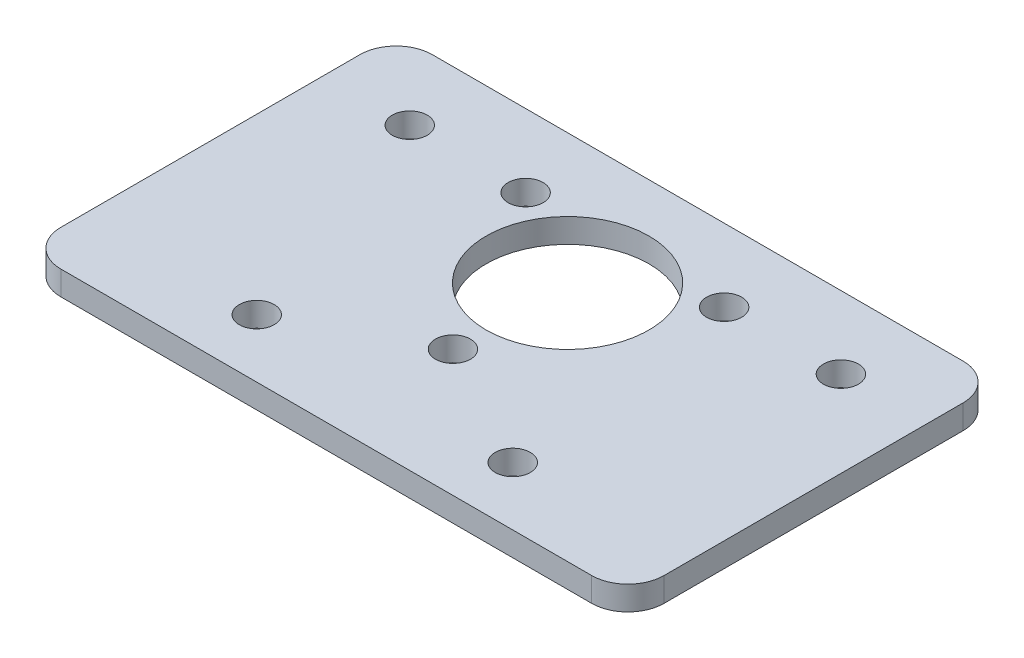
ISO-10303-21;
HEADER;
FILE_DESCRIPTION(('STEP AP214'),'2;1');
FILE_NAME('part.step','',(''),(''),'','','');
FILE_SCHEMA(('AUTOMOTIVE_DESIGN { 1 0 10303 214 1 1 1 1 }'));
ENDSEC;
DATA;
#1=APPLICATION_CONTEXT('core data for automotive mechanical design processes');
#2=APPLICATION_PROTOCOL_DEFINITION('international standard','automotive_design',2000,#1);
#3=PRODUCT_CONTEXT('',#1,'mechanical');
#4=PRODUCT('Part','Part','',(#3));
#5=PRODUCT_RELATED_PRODUCT_CATEGORY('part','',(#4));
#6=PRODUCT_DEFINITION_FORMATION('','',#4);
#7=PRODUCT_DEFINITION_CONTEXT('part definition',#1,'design');
#8=PRODUCT_DEFINITION('design','',#6,#7);
#9=PRODUCT_DEFINITION_SHAPE('','',#8);
#10=(LENGTH_UNIT() NAMED_UNIT(*) SI_UNIT(.MILLI.,.METRE.));
#11=(NAMED_UNIT(*) PLANE_ANGLE_UNIT() SI_UNIT($,.RADIAN.));
#12=(NAMED_UNIT(*) SI_UNIT($,.STERADIAN.) SOLID_ANGLE_UNIT());
#13=UNCERTAINTY_MEASURE_WITH_UNIT(LENGTH_MEASURE(1.E-05),#10,'distance_accuracy_value','');
#14=(GEOMETRIC_REPRESENTATION_CONTEXT(3) GLOBAL_UNCERTAINTY_ASSIGNED_CONTEXT((#13)) GLOBAL_UNIT_ASSIGNED_CONTEXT((#10,
#11,#12)) REPRESENTATION_CONTEXT('',''));
#15=CARTESIAN_POINT('',(0.,0.,0.));
#16=DIRECTION('',(0.,0.,1.));
#17=DIRECTION('',(1.,0.,0.));
#18=AXIS2_PLACEMENT_3D('',#15,#16,#17);
#19=CARTESIAN_POINT('',(0.,2.,0.));
#20=DIRECTION('',(0.,1.,0.));
#21=DIRECTION('',(0.,0.,1.));
#22=AXIS2_PLACEMENT_3D('',#19,#20,#21);
#23=PLANE('',#22);
#24=CARTESIAN_POINT('',(10.6111640724943,2.,15.1543128193464));
#25=DIRECTION('',(0.,1.,0.));
#26=DIRECTION('',(0.,0.,-1.));
#27=AXIS2_PLACEMENT_3D('',#24,#25,#26);
#28=CIRCLE('',#27,1.45);
#29=CARTESIAN_POINT('',(10.6111640724943,2.,13.7043128193464));
#30=VERTEX_POINT('',#29);
#31=EDGE_CURVE('E216',#30,#30,#28,.T.);
#32=ORIENTED_EDGE('',*,*,#31,.F.);
#33=EDGE_LOOP('',(#32));
#34=FACE_BOUND('',#33,.T.);
#35=CARTESIAN_POINT('',(-17.8696277863478,2.,-4.78815233439645));
#36=DIRECTION('',(0.,1.,0.));
#37=DIRECTION('',(0.,0.,1.));
#38=AXIS2_PLACEMENT_3D('',#35,#36,#37);
#39=CIRCLE('',#38,1.45);
#40=CARTESIAN_POINT('',(-17.8696277863478,2.,-3.33815233439645));
#41=VERTEX_POINT('',#40);
#42=EDGE_CURVE('E204',#41,#41,#39,.T.);
#43=ORIENTED_EDGE('',*,*,#42,.F.);
#44=EDGE_LOOP('',(#43));
#45=FACE_BOUND('',#44,.T.);
#46=CARTESIAN_POINT('',(0.,2.,9.5));
#47=DIRECTION('',(0.,1.,0.));
#48=DIRECTION('',(0.,0.,1.));
#49=AXIS2_PLACEMENT_3D('',#46,#47,#48);
#50=CIRCLE('',#49,1.45);
#51=CARTESIAN_POINT('',(0.,2.,10.95));
#52=VERTEX_POINT('',#51);
#53=EDGE_CURVE('E192',#52,#52,#50,.T.);
#54=ORIENTED_EDGE('',*,*,#53,.F.);
#55=EDGE_LOOP('',(#54));
#56=FACE_BOUND('',#55,.T.);
#57=CARTESIAN_POINT('',(0.,2.,0.));
#58=DIRECTION('',(0.,1.,0.));
#59=DIRECTION('',(0.,0.,1.));
#60=AXIS2_PLACEMENT_3D('',#57,#58,#59);
#61=CIRCLE('',#60,6.75);
#62=CARTESIAN_POINT('',(0.,2.,6.75));
#63=VERTEX_POINT('',#62);
#64=EDGE_CURVE('E176',#63,#63,#61,.T.);
#65=ORIENTED_EDGE('',*,*,#64,.F.);
#66=EDGE_LOOP('',(#65));
#67=FACE_BOUND('',#66,.T.);
#68=DIRECTION('',(0.,0.,1.));
#69=VECTOR('',#68,1.);
#70=CARTESIAN_POINT('',(-25.,2.,20.));
#71=LINE('',#70,#69);
#72=CARTESIAN_POINT('',(-25.,2.,-7.78815233439646));
#73=VERTEX_POINT('',#72);
#74=CARTESIAN_POINT('',(-25.,2.,17.));
#75=VERTEX_POINT('',#74);
#76=EDGE_CURVE('E180',#73,#75,#71,.T.);
#77=ORIENTED_EDGE('',*,*,#76,.T.);
#78=CARTESIAN_POINT('',(-22.,2.,17.));
#79=DIRECTION('',(0.,1.,0.));
#80=DIRECTION('',(0.,0.,1.));
#81=AXIS2_PLACEMENT_3D('',#78,#79,#80);
#82=CIRCLE('',#81,3.);
#83=CARTESIAN_POINT('',(-22.,2.,20.));
#84=VERTEX_POINT('',#83);
#85=EDGE_CURVE('E157',#75,#84,#82,.T.);
#86=ORIENTED_EDGE('',*,*,#85,.T.);
#87=DIRECTION('',(1.,0.,0.));
#88=VECTOR('',#87,1.);
#89=CARTESIAN_POINT('',(-25.,2.,20.));
#90=LINE('',#89,#88);
#91=CARTESIAN_POINT('',(22.,2.,20.));
#92=VERTEX_POINT('',#91);
#93=EDGE_CURVE('E128',#84,#92,#90,.T.);
#94=ORIENTED_EDGE('',*,*,#93,.T.);
#95=CARTESIAN_POINT('',(22.,2.,17.));
#96=DIRECTION('',(0.,1.,0.));
#97=DIRECTION('',(0.,0.,1.));
#98=AXIS2_PLACEMENT_3D('',#95,#96,#97);
#99=CIRCLE('',#98,3.);
#100=CARTESIAN_POINT('',(25.,2.,17.));
#101=VERTEX_POINT('',#100);
#102=EDGE_CURVE('E153',#92,#101,#99,.T.);
#103=ORIENTED_EDGE('',*,*,#102,.T.);
#104=DIRECTION('',(0.,0.,-1.));
#105=VECTOR('',#104,1.);
#106=CARTESIAN_POINT('',(25.,2.,-10.7881523343965));
#107=LINE('',#106,#105);
#108=CARTESIAN_POINT('',(25.,2.,-7.78815233439647));
#109=VERTEX_POINT('',#108);
#110=EDGE_CURVE('E136',#101,#109,#107,.T.);
#111=ORIENTED_EDGE('',*,*,#110,.T.);
#112=CARTESIAN_POINT('',(22.,2.,-7.78815233439646));
#113=DIRECTION('',(0.,1.,0.));
#114=DIRECTION('',(0.,0.,1.));
#115=AXIS2_PLACEMENT_3D('',#112,#113,#114);
#116=CIRCLE('',#115,3.);
#117=CARTESIAN_POINT('',(22.,2.,-10.7881523343965));
#118=VERTEX_POINT('',#117);
#119=EDGE_CURVE('E63',#109,#118,#116,.T.);
#120=ORIENTED_EDGE('',*,*,#119,.T.);
#121=DIRECTION('',(-1.,0.,0.));
#122=VECTOR('',#121,1.);
#123=CARTESIAN_POINT('',(-25.,2.,-10.7881523343965));
#124=LINE('',#123,#122);
#125=CARTESIAN_POINT('',(-22.,2.,-10.7881523343965));
#126=VERTEX_POINT('',#125);
#127=EDGE_CURVE('E139',#118,#126,#124,.T.);
#128=ORIENTED_EDGE('',*,*,#127,.T.);
#129=CARTESIAN_POINT('',(-22.,2.,-7.78815233439646));
#130=DIRECTION('',(0.,1.,0.));
#131=DIRECTION('',(0.,0.,1.));
#132=AXIS2_PLACEMENT_3D('',#129,#130,#131);
#133=CIRCLE('',#132,3.);
#134=EDGE_CURVE('E155',#126,#73,#133,.T.);
#135=ORIENTED_EDGE('',*,*,#134,.T.);
#136=EDGE_LOOP('',(#77,#86,#94,#103,#111,#120,#128,#135));
#137=FACE_BOUND('',#136,.T.);
#138=CARTESIAN_POINT('',(-8.22724133595218,2.,-4.74999999999998));
#139=DIRECTION('',(0.,1.,0.));
#140=DIRECTION('',(0.,0.,1.));
#141=AXIS2_PLACEMENT_3D('',#138,#139,#140);
#142=CIRCLE('',#141,1.45);
#143=CARTESIAN_POINT('',(-8.22724133595218,2.,-3.29999999999998));
#144=VERTEX_POINT('',#143);
#145=EDGE_CURVE('E186',#144,#144,#142,.T.);
#146=ORIENTED_EDGE('',*,*,#145,.F.);
#147=EDGE_LOOP('',(#146));
#148=FACE_BOUND('',#147,.T.);
#149=CARTESIAN_POINT('',(8.22724133595218,2.,-4.74999999999998));
#150=DIRECTION('',(0.,1.,0.));
#151=DIRECTION('',(0.,0.,-1.));
#152=AXIS2_PLACEMENT_3D('',#149,#150,#151);
#153=CIRCLE('',#152,1.45);
#154=CARTESIAN_POINT('',(8.22724133595218,2.,-6.19999999999998));
#155=VERTEX_POINT('',#154);
#156=EDGE_CURVE('E198',#155,#155,#153,.T.);
#157=ORIENTED_EDGE('',*,*,#156,.F.);
#158=EDGE_LOOP('',(#157));
#159=FACE_BOUND('',#158,.T.);
#160=CARTESIAN_POINT('',(-10.6111640724943,2.,15.1543128193464));
#161=DIRECTION('',(0.,1.,0.));
#162=DIRECTION('',(0.,0.,1.));
#163=AXIS2_PLACEMENT_3D('',#160,#161,#162);
#164=CIRCLE('',#163,1.45);
#165=CARTESIAN_POINT('',(-10.6111640724943,2.,16.6043128193464));
#166=VERTEX_POINT('',#165);
#167=EDGE_CURVE('E210',#166,#166,#164,.T.);
#168=ORIENTED_EDGE('',*,*,#167,.F.);
#169=EDGE_LOOP('',(#168));
#170=FACE_BOUND('',#169,.T.);
#171=CARTESIAN_POINT('',(17.8696277863478,2.,-4.78815233439645));
#172=DIRECTION('',(0.,1.,0.));
#173=DIRECTION('',(0.,0.,-1.));
#174=AXIS2_PLACEMENT_3D('',#171,#172,#173);
#175=CIRCLE('',#174,1.45);
#176=CARTESIAN_POINT('',(17.8696277863478,2.,-6.23815233439645));
#177=VERTEX_POINT('',#176);
#178=EDGE_CURVE('E222',#177,#177,#175,.T.);
#179=ORIENTED_EDGE('',*,*,#178,.F.);
#180=EDGE_LOOP('',(#179));
#181=FACE_BOUND('',#180,.T.);
#182=ADVANCED_FACE('F41',(#34,#45,#56,#67,#137,#148,#159,#170,#181),#23,.T.);
#183=CARTESIAN_POINT('',(0.,0.,0.));
#184=DIRECTION('',(0.,1.,0.));
#185=DIRECTION('',(0.,0.,1.));
#186=AXIS2_PLACEMENT_3D('',#183,#184,#185);
#187=PLANE('',#186);
#188=DIRECTION('',(1.,0.,0.));
#189=VECTOR('',#188,1.);
#190=CARTESIAN_POINT('',(-25.,0.,20.));
#191=LINE('',#190,#189);
#192=CARTESIAN_POINT('',(-22.,0.,20.));
#193=VERTEX_POINT('',#192);
#194=CARTESIAN_POINT('',(22.,0.,20.));
#195=VERTEX_POINT('',#194);
#196=EDGE_CURVE('E125',#193,#195,#191,.T.);
#197=ORIENTED_EDGE('',*,*,#196,.F.);
#198=CARTESIAN_POINT('',(-22.,0.,17.));
#199=DIRECTION('',(0.,1.,0.));
#200=DIRECTION('',(0.,0.,1.));
#201=AXIS2_PLACEMENT_3D('',#198,#199,#200);
#202=CIRCLE('',#201,3.);
#203=CARTESIAN_POINT('',(-25.,0.,17.));
#204=VERTEX_POINT('',#203);
#205=EDGE_CURVE('E108',#193,#204,#202,.F.);
#206=ORIENTED_EDGE('',*,*,#205,.T.);
#207=DIRECTION('',(0.,0.,1.));
#208=VECTOR('',#207,1.);
#209=CARTESIAN_POINT('',(-25.,0.,20.));
#210=LINE('',#209,#208);
#211=CARTESIAN_POINT('',(-25.,0.,-7.78815233439646));
#212=VERTEX_POINT('',#211);
#213=EDGE_CURVE('E137',#212,#204,#210,.T.);
#214=ORIENTED_EDGE('',*,*,#213,.F.);
#215=CARTESIAN_POINT('',(-22.,0.,-7.78815233439646));
#216=DIRECTION('',(0.,1.,0.));
#217=DIRECTION('',(0.,0.,1.));
#218=AXIS2_PLACEMENT_3D('',#215,#216,#217);
#219=CIRCLE('',#218,3.);
#220=CARTESIAN_POINT('',(-22.,0.,-10.7881523343965));
#221=VERTEX_POINT('',#220);
#222=EDGE_CURVE('E119',#212,#221,#219,.F.);
#223=ORIENTED_EDGE('',*,*,#222,.T.);
#224=DIRECTION('',(-1.,0.,0.));
#225=VECTOR('',#224,1.);
#226=CARTESIAN_POINT('',(-25.,0.,-10.7881523343965));
#227=LINE('',#226,#225);
#228=CARTESIAN_POINT('',(22.,0.,-10.7881523343965));
#229=VERTEX_POINT('',#228);
#230=EDGE_CURVE('E141',#229,#221,#227,.T.);
#231=ORIENTED_EDGE('',*,*,#230,.F.);
#232=CARTESIAN_POINT('',(22.,0.,-7.78815233439646));
#233=DIRECTION('',(0.,1.,0.));
#234=DIRECTION('',(0.,0.,1.));
#235=AXIS2_PLACEMENT_3D('',#232,#233,#234);
#236=CIRCLE('',#235,3.);
#237=CARTESIAN_POINT('',(25.,0.,-7.78815233439647));
#238=VERTEX_POINT('',#237);
#239=EDGE_CURVE('E129',#229,#238,#236,.F.);
#240=ORIENTED_EDGE('',*,*,#239,.T.);
#241=DIRECTION('',(0.,0.,-1.));
#242=VECTOR('',#241,1.);
#243=CARTESIAN_POINT('',(25.,0.,-10.7881523343965));
#244=LINE('',#243,#242);
#245=CARTESIAN_POINT('',(25.,0.,17.));
#246=VERTEX_POINT('',#245);
#247=EDGE_CURVE('E168',#246,#238,#244,.T.);
#248=ORIENTED_EDGE('',*,*,#247,.F.);
#249=CARTESIAN_POINT('',(22.,0.,17.));
#250=DIRECTION('',(0.,1.,0.));
#251=DIRECTION('',(0.,0.,1.));
#252=AXIS2_PLACEMENT_3D('',#249,#250,#251);
#253=CIRCLE('',#252,3.);
#254=EDGE_CURVE('E135',#246,#195,#253,.F.);
#255=ORIENTED_EDGE('',*,*,#254,.T.);
#256=EDGE_LOOP('',(#197,#206,#214,#223,#231,#240,#248,#255));
#257=FACE_BOUND('',#256,.T.);
#258=CARTESIAN_POINT('',(0.,0.,0.));
#259=DIRECTION('',(0.,1.,0.));
#260=DIRECTION('',(0.,0.,1.));
#261=AXIS2_PLACEMENT_3D('',#258,#259,#260);
#262=CIRCLE('',#261,6.75);
#263=CARTESIAN_POINT('',(0.,0.,6.75));
#264=VERTEX_POINT('',#263);
#265=EDGE_CURVE('E183',#264,#264,#262,.T.);
#266=ORIENTED_EDGE('',*,*,#265,.T.);
#267=EDGE_LOOP('',(#266));
#268=FACE_BOUND('',#267,.T.);
#269=CARTESIAN_POINT('',(-8.22724133595218,0.,-4.74999999999998));
#270=DIRECTION('',(0.,1.,0.));
#271=DIRECTION('',(0.,0.,1.));
#272=AXIS2_PLACEMENT_3D('',#269,#270,#271);
#273=CIRCLE('',#272,1.45);
#274=CARTESIAN_POINT('',(-8.22724133595218,0.,-3.29999999999998));
#275=VERTEX_POINT('',#274);
#276=EDGE_CURVE('E189',#275,#275,#273,.T.);
#277=ORIENTED_EDGE('',*,*,#276,.T.);
#278=EDGE_LOOP('',(#277));
#279=FACE_BOUND('',#278,.T.);
#280=CARTESIAN_POINT('',(0.,0.,9.5));
#281=DIRECTION('',(0.,1.,0.));
#282=DIRECTION('',(0.,0.,1.));
#283=AXIS2_PLACEMENT_3D('',#280,#281,#282);
#284=CIRCLE('',#283,1.45);
#285=CARTESIAN_POINT('',(0.,0.,10.95));
#286=VERTEX_POINT('',#285);
#287=EDGE_CURVE('E195',#286,#286,#284,.T.);
#288=ORIENTED_EDGE('',*,*,#287,.T.);
#289=EDGE_LOOP('',(#288));
#290=FACE_BOUND('',#289,.T.);
#291=CARTESIAN_POINT('',(8.22724133595218,0.,-4.74999999999998));
#292=DIRECTION('',(0.,1.,0.));
#293=DIRECTION('',(0.,0.,-1.));
#294=AXIS2_PLACEMENT_3D('',#291,#292,#293);
#295=CIRCLE('',#294,1.45);
#296=CARTESIAN_POINT('',(8.22724133595218,0.,-6.19999999999998));
#297=VERTEX_POINT('',#296);
#298=EDGE_CURVE('E201',#297,#297,#295,.T.);
#299=ORIENTED_EDGE('',*,*,#298,.T.);
#300=EDGE_LOOP('',(#299));
#301=FACE_BOUND('',#300,.T.);
#302=CARTESIAN_POINT('',(-17.8696277863478,0.,-4.78815233439645));
#303=DIRECTION('',(0.,1.,0.));
#304=DIRECTION('',(0.,0.,1.));
#305=AXIS2_PLACEMENT_3D('',#302,#303,#304);
#306=CIRCLE('',#305,1.45);
#307=CARTESIAN_POINT('',(-17.8696277863478,0.,-3.33815233439645));
#308=VERTEX_POINT('',#307);
#309=EDGE_CURVE('E207',#308,#308,#306,.T.);
#310=ORIENTED_EDGE('',*,*,#309,.T.);
#311=EDGE_LOOP('',(#310));
#312=FACE_BOUND('',#311,.T.);
#313=CARTESIAN_POINT('',(-10.6111640724943,0.,15.1543128193464));
#314=DIRECTION('',(0.,1.,0.));
#315=DIRECTION('',(0.,0.,1.));
#316=AXIS2_PLACEMENT_3D('',#313,#314,#315);
#317=CIRCLE('',#316,1.45);
#318=CARTESIAN_POINT('',(-10.6111640724943,0.,16.6043128193464));
#319=VERTEX_POINT('',#318);
#320=EDGE_CURVE('E213',#319,#319,#317,.T.);
#321=ORIENTED_EDGE('',*,*,#320,.T.);
#322=EDGE_LOOP('',(#321));
#323=FACE_BOUND('',#322,.T.);
#324=CARTESIAN_POINT('',(10.6111640724943,0.,15.1543128193464));
#325=DIRECTION('',(0.,1.,0.));
#326=DIRECTION('',(0.,0.,-1.));
#327=AXIS2_PLACEMENT_3D('',#324,#325,#326);
#328=CIRCLE('',#327,1.45);
#329=CARTESIAN_POINT('',(10.6111640724943,0.,13.7043128193464));
#330=VERTEX_POINT('',#329);
#331=EDGE_CURVE('E219',#330,#330,#328,.T.);
#332=ORIENTED_EDGE('',*,*,#331,.T.);
#333=EDGE_LOOP('',(#332));
#334=FACE_BOUND('',#333,.T.);
#335=CARTESIAN_POINT('',(17.8696277863478,0.,-4.78815233439645));
#336=DIRECTION('',(0.,1.,0.));
#337=DIRECTION('',(0.,0.,-1.));
#338=AXIS2_PLACEMENT_3D('',#335,#336,#337);
#339=CIRCLE('',#338,1.45);
#340=CARTESIAN_POINT('',(17.8696277863478,0.,-6.23815233439645));
#341=VERTEX_POINT('',#340);
#342=EDGE_CURVE('E225',#341,#341,#339,.T.);
#343=ORIENTED_EDGE('',*,*,#342,.T.);
#344=EDGE_LOOP('',(#343));
#345=FACE_BOUND('',#344,.T.);
#346=ADVANCED_FACE('F132',(#257,#268,#279,#290,#301,#312,#323,#334,#345),#187,.F.);
#347=CARTESIAN_POINT('',(25.,2.,-10.7881523343965));
#348=DIRECTION('',(-1.,0.,0.));
#349=DIRECTION('',(0.,0.,1.));
#350=AXIS2_PLACEMENT_3D('',#347,#348,#349);
#351=PLANE('',#350);
#352=ORIENTED_EDGE('',*,*,#110,.F.);
#353=DIRECTION('',(0.,-1.,0.));
#354=VECTOR('',#353,1.);
#355=CARTESIAN_POINT('',(25.,2.,17.));
#356=LINE('',#355,#354);
#357=EDGE_CURVE('E11',#101,#246,#356,.T.);
#358=ORIENTED_EDGE('',*,*,#357,.T.);
#359=ORIENTED_EDGE('',*,*,#247,.T.);
#360=DIRECTION('',(0.,-1.,0.));
#361=VECTOR('',#360,1.);
#362=CARTESIAN_POINT('',(25.,2.,-7.78815233439647));
#363=LINE('',#362,#361);
#364=EDGE_CURVE('E49',#238,#109,#363,.F.);
#365=ORIENTED_EDGE('',*,*,#364,.T.);
#366=EDGE_LOOP('',(#352,#358,#359,#365));
#367=FACE_BOUND('',#366,.T.);
#368=ADVANCED_FACE('F166',(#367),#351,.F.);
#369=CARTESIAN_POINT('',(-25.,2.,-10.7881523343965));
#370=DIRECTION('',(0.,0.,1.));
#371=DIRECTION('',(1.,0.,0.));
#372=AXIS2_PLACEMENT_3D('',#369,#370,#371);
#373=PLANE('',#372);
#374=ORIENTED_EDGE('',*,*,#230,.T.);
#375=DIRECTION('',(0.,-1.,0.));
#376=VECTOR('',#375,1.);
#377=CARTESIAN_POINT('',(-22.,2.,-10.7881523343965));
#378=LINE('',#377,#376);
#379=EDGE_CURVE('E56',#221,#126,#378,.F.);
#380=ORIENTED_EDGE('',*,*,#379,.T.);
#381=ORIENTED_EDGE('',*,*,#127,.F.);
#382=DIRECTION('',(0.,-1.,0.));
#383=VECTOR('',#382,1.);
#384=CARTESIAN_POINT('',(22.,2.,-10.7881523343965));
#385=LINE('',#384,#383);
#386=EDGE_CURVE('E159',#118,#229,#385,.T.);
#387=ORIENTED_EDGE('',*,*,#386,.T.);
#388=EDGE_LOOP('',(#374,#380,#381,#387));
#389=FACE_BOUND('',#388,.T.);
#390=ADVANCED_FACE('F175',(#389),#373,.F.);
#391=CARTESIAN_POINT('',(-25.,2.,20.));
#392=DIRECTION('',(1.,0.,0.));
#393=DIRECTION('',(0.,0.,-1.));
#394=AXIS2_PLACEMENT_3D('',#391,#392,#393);
#395=PLANE('',#394);
#396=ORIENTED_EDGE('',*,*,#213,.T.);
#397=DIRECTION('',(0.,-1.,0.));
#398=VECTOR('',#397,1.);
#399=CARTESIAN_POINT('',(-25.,2.,17.));
#400=LINE('',#399,#398);
#401=EDGE_CURVE('E113',#204,#75,#400,.F.);
#402=ORIENTED_EDGE('',*,*,#401,.T.);
#403=ORIENTED_EDGE('',*,*,#76,.F.);
#404=DIRECTION('',(0.,-1.,0.));
#405=VECTOR('',#404,1.);
#406=CARTESIAN_POINT('',(-25.,2.,-7.78815233439646));
#407=LINE('',#406,#405);
#408=EDGE_CURVE('E118',#73,#212,#407,.T.);
#409=ORIENTED_EDGE('',*,*,#408,.T.);
#410=EDGE_LOOP('',(#396,#402,#403,#409));
#411=FACE_BOUND('',#410,.T.);
#412=ADVANCED_FACE('F250',(#411),#395,.F.);
#413=CARTESIAN_POINT('',(-25.,2.,20.));
#414=DIRECTION('',(0.,0.,-1.));
#415=DIRECTION('',(-1.,0.,0.));
#416=AXIS2_PLACEMENT_3D('',#413,#414,#415);
#417=PLANE('',#416);
#418=ORIENTED_EDGE('',*,*,#93,.F.);
#419=DIRECTION('',(0.,-1.,0.));
#420=VECTOR('',#419,1.);
#421=CARTESIAN_POINT('',(-22.,2.,20.));
#422=LINE('',#421,#420);
#423=EDGE_CURVE('E112',#84,#193,#422,.T.);
#424=ORIENTED_EDGE('',*,*,#423,.T.);
#425=ORIENTED_EDGE('',*,*,#196,.T.);
#426=DIRECTION('',(0.,-1.,0.));
#427=VECTOR('',#426,1.);
#428=CARTESIAN_POINT('',(22.,2.,20.));
#429=LINE('',#428,#427);
#430=EDGE_CURVE('E130',#195,#92,#429,.F.);
#431=ORIENTED_EDGE('',*,*,#430,.T.);
#432=EDGE_LOOP('',(#418,#424,#425,#431));
#433=FACE_BOUND('',#432,.T.);
#434=ADVANCED_FACE('F124',(#433),#417,.F.);
#435=CARTESIAN_POINT('',(0.,2.,0.));
#436=DIRECTION('',(0.,-1.,0.));
#437=DIRECTION('',(0.,0.,-1.));
#438=AXIS2_PLACEMENT_3D('',#435,#436,#437);
#439=CYLINDRICAL_SURFACE('',#438,6.75);
#440=ORIENTED_EDGE('',*,*,#64,.T.);
#441=EDGE_LOOP('',(#440));
#442=FACE_BOUND('',#441,.T.);
#443=ORIENTED_EDGE('',*,*,#265,.F.);
#444=EDGE_LOOP('',(#443));
#445=FACE_BOUND('',#444,.T.);
#446=ADVANCED_FACE('F245',(#442,#445),#439,.F.);
#447=CARTESIAN_POINT('',(-8.22724133595218,2.,-4.74999999999998));
#448=DIRECTION('',(0.,-1.,0.));
#449=DIRECTION('',(0.,0.,-1.));
#450=AXIS2_PLACEMENT_3D('',#447,#448,#449);
#451=CYLINDRICAL_SURFACE('',#450,1.45);
#452=ORIENTED_EDGE('',*,*,#145,.T.);
#453=EDGE_LOOP('',(#452));
#454=FACE_BOUND('',#453,.T.);
#455=ORIENTED_EDGE('',*,*,#276,.F.);
#456=EDGE_LOOP('',(#455));
#457=FACE_BOUND('',#456,.T.);
#458=ADVANCED_FACE('F348',(#454,#457),#451,.F.);
#459=CARTESIAN_POINT('',(0.,2.,9.5));
#460=DIRECTION('',(0.,-1.,0.));
#461=DIRECTION('',(0.,0.,-1.));
#462=AXIS2_PLACEMENT_3D('',#459,#460,#461);
#463=CYLINDRICAL_SURFACE('',#462,1.45);
#464=ORIENTED_EDGE('',*,*,#53,.T.);
#465=EDGE_LOOP('',(#464));
#466=FACE_BOUND('',#465,.T.);
#467=ORIENTED_EDGE('',*,*,#287,.F.);
#468=EDGE_LOOP('',(#467));
#469=FACE_BOUND('',#468,.T.);
#470=ADVANCED_FACE('F338',(#466,#469),#463,.F.);
#471=CARTESIAN_POINT('',(8.22724133595218,2.,-4.74999999999998));
#472=DIRECTION('',(0.,-1.,0.));
#473=DIRECTION('',(0.,0.,-1.));
#474=AXIS2_PLACEMENT_3D('',#471,#472,#473);
#475=CYLINDRICAL_SURFACE('',#474,1.45);
#476=ORIENTED_EDGE('',*,*,#156,.T.);
#477=EDGE_LOOP('',(#476));
#478=FACE_BOUND('',#477,.T.);
#479=ORIENTED_EDGE('',*,*,#298,.F.);
#480=EDGE_LOOP('',(#479));
#481=FACE_BOUND('',#480,.T.);
#482=ADVANCED_FACE('F328',(#478,#481),#475,.F.);
#483=CARTESIAN_POINT('',(-17.8696277863478,2.,-4.78815233439645));
#484=DIRECTION('',(0.,-1.,0.));
#485=DIRECTION('',(0.,0.,-1.));
#486=AXIS2_PLACEMENT_3D('',#483,#484,#485);
#487=CYLINDRICAL_SURFACE('',#486,1.45);
#488=ORIENTED_EDGE('',*,*,#42,.T.);
#489=EDGE_LOOP('',(#488));
#490=FACE_BOUND('',#489,.T.);
#491=ORIENTED_EDGE('',*,*,#309,.F.);
#492=EDGE_LOOP('',(#491));
#493=FACE_BOUND('',#492,.T.);
#494=ADVANCED_FACE('F318',(#490,#493),#487,.F.);
#495=CARTESIAN_POINT('',(-10.6111640724943,2.,15.1543128193464));
#496=DIRECTION('',(0.,-1.,0.));
#497=DIRECTION('',(0.,0.,-1.));
#498=AXIS2_PLACEMENT_3D('',#495,#496,#497);
#499=CYLINDRICAL_SURFACE('',#498,1.45);
#500=ORIENTED_EDGE('',*,*,#167,.T.);
#501=EDGE_LOOP('',(#500));
#502=FACE_BOUND('',#501,.T.);
#503=ORIENTED_EDGE('',*,*,#320,.F.);
#504=EDGE_LOOP('',(#503));
#505=FACE_BOUND('',#504,.T.);
#506=ADVANCED_FACE('F308',(#502,#505),#499,.F.);
#507=CARTESIAN_POINT('',(10.6111640724943,2.,15.1543128193464));
#508=DIRECTION('',(0.,-1.,0.));
#509=DIRECTION('',(0.,0.,-1.));
#510=AXIS2_PLACEMENT_3D('',#507,#508,#509);
#511=CYLINDRICAL_SURFACE('',#510,1.45);
#512=ORIENTED_EDGE('',*,*,#31,.T.);
#513=EDGE_LOOP('',(#512));
#514=FACE_BOUND('',#513,.T.);
#515=ORIENTED_EDGE('',*,*,#331,.F.);
#516=EDGE_LOOP('',(#515));
#517=FACE_BOUND('',#516,.T.);
#518=ADVANCED_FACE('F299',(#514,#517),#511,.F.);
#519=CARTESIAN_POINT('',(17.8696277863478,2.,-4.78815233439645));
#520=DIRECTION('',(0.,-1.,0.));
#521=DIRECTION('',(0.,0.,-1.));
#522=AXIS2_PLACEMENT_3D('',#519,#520,#521);
#523=CYLINDRICAL_SURFACE('',#522,1.45);
#524=ORIENTED_EDGE('',*,*,#178,.T.);
#525=EDGE_LOOP('',(#524));
#526=FACE_BOUND('',#525,.T.);
#527=ORIENTED_EDGE('',*,*,#342,.F.);
#528=EDGE_LOOP('',(#527));
#529=FACE_BOUND('',#528,.T.);
#530=ADVANCED_FACE('F231',(#526,#529),#523,.F.);
#531=CARTESIAN_POINT('',(-22.,2.,17.));
#532=DIRECTION('',(0.,-1.,0.));
#533=DIRECTION('',(0.,0.,-1.));
#534=AXIS2_PLACEMENT_3D('',#531,#532,#533);
#535=CYLINDRICAL_SURFACE('',#534,3.);
#536=ORIENTED_EDGE('',*,*,#85,.F.);
#537=ORIENTED_EDGE('',*,*,#401,.F.);
#538=ORIENTED_EDGE('',*,*,#205,.F.);
#539=ORIENTED_EDGE('',*,*,#423,.F.);
#540=EDGE_LOOP('',(#536,#537,#538,#539));
#541=FACE_BOUND('',#540,.T.);
#542=ADVANCED_FACE('F111',(#541),#535,.T.);
#543=CARTESIAN_POINT('',(-22.,2.,-7.78815233439646));
#544=DIRECTION('',(0.,-1.,0.));
#545=DIRECTION('',(0.,0.,-1.));
#546=AXIS2_PLACEMENT_3D('',#543,#544,#545);
#547=CYLINDRICAL_SURFACE('',#546,3.);
#548=ORIENTED_EDGE('',*,*,#134,.F.);
#549=ORIENTED_EDGE('',*,*,#379,.F.);
#550=ORIENTED_EDGE('',*,*,#222,.F.);
#551=ORIENTED_EDGE('',*,*,#408,.F.);
#552=EDGE_LOOP('',(#548,#549,#550,#551));
#553=FACE_BOUND('',#552,.T.);
#554=ADVANCED_FACE('F260',(#553),#547,.T.);
#555=CARTESIAN_POINT('',(22.,2.,17.));
#556=DIRECTION('',(0.,-1.,0.));
#557=DIRECTION('',(0.,0.,-1.));
#558=AXIS2_PLACEMENT_3D('',#555,#556,#557);
#559=CYLINDRICAL_SURFACE('',#558,3.);
#560=ORIENTED_EDGE('',*,*,#102,.F.);
#561=ORIENTED_EDGE('',*,*,#430,.F.);
#562=ORIENTED_EDGE('',*,*,#254,.F.);
#563=ORIENTED_EDGE('',*,*,#357,.F.);
#564=EDGE_LOOP('',(#560,#561,#562,#563));
#565=FACE_BOUND('',#564,.T.);
#566=ADVANCED_FACE('F262',(#565),#559,.T.);
#567=CARTESIAN_POINT('',(22.,2.,-7.78815233439646));
#568=DIRECTION('',(0.,-1.,0.));
#569=DIRECTION('',(0.,0.,-1.));
#570=AXIS2_PLACEMENT_3D('',#567,#568,#569);
#571=CYLINDRICAL_SURFACE('',#570,3.);
#572=ORIENTED_EDGE('',*,*,#119,.F.);
#573=ORIENTED_EDGE('',*,*,#364,.F.);
#574=ORIENTED_EDGE('',*,*,#239,.F.);
#575=ORIENTED_EDGE('',*,*,#386,.F.);
#576=EDGE_LOOP('',(#572,#573,#574,#575));
#577=FACE_BOUND('',#576,.T.);
#578=ADVANCED_FACE('F43',(#577),#571,.T.);
#579=CLOSED_SHELL('',(#182,#346,#368,#390,#412,#434,#446,#458,#470,#482,#494,#506,#518,#530,
#542,#554,#566,#578));
#580=MANIFOLD_SOLID_BREP('B2',#579);
#581=ADVANCED_BREP_SHAPE_REPRESENTATION('',(#18,#580),#14);
#582=SHAPE_DEFINITION_REPRESENTATION(#9,#581);
ENDSEC;
END-ISO-10303-21;
